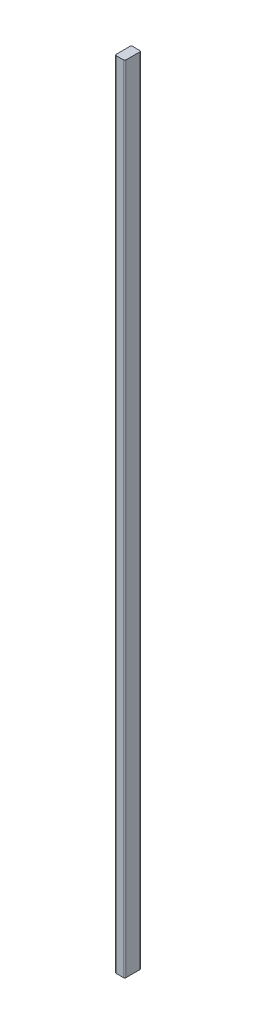
ISO-10303-21;
HEADER;
FILE_DESCRIPTION(('STEP AP214'),'2;1');
FILE_NAME('part.step','',(''),(''),'','','');
FILE_SCHEMA(('AUTOMOTIVE_DESIGN { 1 0 10303 214 1 1 1 1 }'));
ENDSEC;
DATA;
#1=APPLICATION_CONTEXT('core data for automotive mechanical design processes');
#2=APPLICATION_PROTOCOL_DEFINITION('international standard','automotive_design',2000,#1);
#3=PRODUCT_CONTEXT('',#1,'mechanical');
#4=PRODUCT('Part','Part','',(#3));
#5=PRODUCT_RELATED_PRODUCT_CATEGORY('part','',(#4));
#6=PRODUCT_DEFINITION_FORMATION('','',#4);
#7=PRODUCT_DEFINITION_CONTEXT('part definition',#1,'design');
#8=PRODUCT_DEFINITION('design','',#6,#7);
#9=PRODUCT_DEFINITION_SHAPE('','',#8);
#10=(LENGTH_UNIT() NAMED_UNIT(*) SI_UNIT(.MILLI.,.METRE.));
#11=(NAMED_UNIT(*) PLANE_ANGLE_UNIT() SI_UNIT($,.RADIAN.));
#12=(NAMED_UNIT(*) SI_UNIT($,.STERADIAN.) SOLID_ANGLE_UNIT());
#13=UNCERTAINTY_MEASURE_WITH_UNIT(LENGTH_MEASURE(1.E-05),#10,'distance_accuracy_value','');
#14=(GEOMETRIC_REPRESENTATION_CONTEXT(3) GLOBAL_UNCERTAINTY_ASSIGNED_CONTEXT((#13)) GLOBAL_UNIT_ASSIGNED_CONTEXT((#10,
#11,#12)) REPRESENTATION_CONTEXT('',''));
#15=CARTESIAN_POINT('',(0.,0.,0.));
#16=DIRECTION('',(0.,0.,1.));
#17=DIRECTION('',(1.,0.,0.));
#18=AXIS2_PLACEMENT_3D('',#15,#16,#17);
#19=CARTESIAN_POINT('',(2.25,489.,4.25));
#20=DIRECTION('',(0.,-1.,0.));
#21=DIRECTION('',(0.,0.,-1.));
#22=AXIS2_PLACEMENT_3D('',#19,#20,#21);
#23=CYLINDRICAL_SURFACE('',#22,0.75);
#24=CARTESIAN_POINT('',(2.25,0.,4.25));
#25=DIRECTION('',(0.,1.,0.));
#26=DIRECTION('',(0.,0.,1.));
#27=AXIS2_PLACEMENT_3D('',#24,#25,#26);
#28=CIRCLE('',#27,0.75);
#29=CARTESIAN_POINT('',(2.25,0.,5.));
#30=VERTEX_POINT('',#29);
#31=CARTESIAN_POINT('',(3.,0.,4.24999999999999));
#32=VERTEX_POINT('',#31);
#33=EDGE_CURVE('E131',#30,#32,#28,.T.);
#34=ORIENTED_EDGE('',*,*,#33,.T.);
#35=DIRECTION('',(0.,-1.,0.));
#36=VECTOR('',#35,1.);
#37=CARTESIAN_POINT('',(3.,489.,4.24999999999999));
#38=LINE('',#37,#36);
#39=CARTESIAN_POINT('',(3.,489.,4.24999999999999));
#40=VERTEX_POINT('',#39);
#41=EDGE_CURVE('E11',#40,#32,#38,.T.);
#42=ORIENTED_EDGE('',*,*,#41,.F.);
#43=CARTESIAN_POINT('',(2.25,489.,4.25));
#44=DIRECTION('',(0.,1.,0.));
#45=DIRECTION('',(0.,0.,1.));
#46=AXIS2_PLACEMENT_3D('',#43,#44,#45);
#47=CIRCLE('',#46,0.75);
#48=CARTESIAN_POINT('',(2.25,489.,5.));
#49=VERTEX_POINT('',#48);
#50=EDGE_CURVE('E145',#49,#40,#47,.T.);
#51=ORIENTED_EDGE('',*,*,#50,.F.);
#52=DIRECTION('',(0.,-1.,0.));
#53=VECTOR('',#52,1.);
#54=CARTESIAN_POINT('',(2.25,489.,5.));
#55=LINE('',#54,#53);
#56=EDGE_CURVE('E127',#49,#30,#55,.T.);
#57=ORIENTED_EDGE('',*,*,#56,.T.);
#58=EDGE_LOOP('',(#34,#42,#51,#57));
#59=FACE_BOUND('',#58,.T.);
#60=ADVANCED_FACE('F35',(#59),#23,.T.);
#61=CARTESIAN_POINT('',(3.,489.,-4.25));
#62=DIRECTION('',(-1.,0.,0.));
#63=DIRECTION('',(0.,0.,1.));
#64=AXIS2_PLACEMENT_3D('',#61,#62,#63);
#65=PLANE('',#64);
#66=DIRECTION('',(0.,0.,-1.));
#67=VECTOR('',#66,1.);
#68=CARTESIAN_POINT('',(3.,0.,-4.25));
#69=LINE('',#68,#67);
#70=CARTESIAN_POINT('',(3.,0.,-4.25));
#71=VERTEX_POINT('',#70);
#72=EDGE_CURVE('E134',#32,#71,#69,.T.);
#73=ORIENTED_EDGE('',*,*,#72,.T.);
#74=DIRECTION('',(0.,-1.,0.));
#75=VECTOR('',#74,1.);
#76=CARTESIAN_POINT('',(3.,489.,-4.25));
#77=LINE('',#76,#75);
#78=CARTESIAN_POINT('',(3.,489.,-4.25));
#79=VERTEX_POINT('',#78);
#80=EDGE_CURVE('E43',#79,#71,#77,.T.);
#81=ORIENTED_EDGE('',*,*,#80,.F.);
#82=DIRECTION('',(0.,0.,-1.));
#83=VECTOR('',#82,1.);
#84=CARTESIAN_POINT('',(3.,489.,-4.25));
#85=LINE('',#84,#83);
#86=EDGE_CURVE('E94',#40,#79,#85,.T.);
#87=ORIENTED_EDGE('',*,*,#86,.F.);
#88=ORIENTED_EDGE('',*,*,#41,.T.);
#89=EDGE_LOOP('',(#73,#81,#87,#88));
#90=FACE_BOUND('',#89,.T.);
#91=ADVANCED_FACE('F180',(#90),#65,.F.);
#92=CARTESIAN_POINT('',(2.25,489.,-4.25));
#93=DIRECTION('',(0.,-1.,0.));
#94=DIRECTION('',(0.,0.,-1.));
#95=AXIS2_PLACEMENT_3D('',#92,#93,#94);
#96=CYLINDRICAL_SURFACE('',#95,0.75);
#97=CARTESIAN_POINT('',(2.25,0.,-4.25));
#98=DIRECTION('',(0.,1.,0.));
#99=DIRECTION('',(0.,0.,-1.));
#100=AXIS2_PLACEMENT_3D('',#97,#98,#99);
#101=CIRCLE('',#100,0.75);
#102=CARTESIAN_POINT('',(2.24999999999999,0.,-5.));
#103=VERTEX_POINT('',#102);
#104=EDGE_CURVE('E136',#71,#103,#101,.T.);
#105=ORIENTED_EDGE('',*,*,#104,.T.);
#106=DIRECTION('',(0.,-1.,0.));
#107=VECTOR('',#106,1.);
#108=CARTESIAN_POINT('',(2.24999999999999,489.,-5.));
#109=LINE('',#108,#107);
#110=CARTESIAN_POINT('',(2.24999999999999,489.,-5.));
#111=VERTEX_POINT('',#110);
#112=EDGE_CURVE('E152',#111,#103,#109,.T.);
#113=ORIENTED_EDGE('',*,*,#112,.F.);
#114=CARTESIAN_POINT('',(2.25,489.,-4.25));
#115=DIRECTION('',(0.,1.,0.));
#116=DIRECTION('',(0.,0.,-1.));
#117=AXIS2_PLACEMENT_3D('',#114,#115,#116);
#118=CIRCLE('',#117,0.75);
#119=EDGE_CURVE('E160',#79,#111,#118,.T.);
#120=ORIENTED_EDGE('',*,*,#119,.F.);
#121=ORIENTED_EDGE('',*,*,#80,.T.);
#122=EDGE_LOOP('',(#105,#113,#120,#121));
#123=FACE_BOUND('',#122,.T.);
#124=ADVANCED_FACE('F158',(#123),#96,.T.);
#125=CARTESIAN_POINT('',(2.24999999999999,489.,-5.));
#126=DIRECTION('',(0.,0.,1.));
#127=DIRECTION('',(1.,0.,0.));
#128=AXIS2_PLACEMENT_3D('',#125,#126,#127);
#129=PLANE('',#128);
#130=DIRECTION('',(-1.,0.,0.));
#131=VECTOR('',#130,1.);
#132=CARTESIAN_POINT('',(2.24999999999999,0.,-5.));
#133=LINE('',#132,#131);
#134=CARTESIAN_POINT('',(-2.25,0.,-5.));
#135=VERTEX_POINT('',#134);
#136=EDGE_CURVE('E138',#103,#135,#133,.T.);
#137=ORIENTED_EDGE('',*,*,#136,.T.);
#138=DIRECTION('',(0.,-1.,0.));
#139=VECTOR('',#138,1.);
#140=CARTESIAN_POINT('',(-2.25,489.,-5.));
#141=LINE('',#140,#139);
#142=CARTESIAN_POINT('',(-2.25,489.,-5.));
#143=VERTEX_POINT('',#142);
#144=EDGE_CURVE('E149',#143,#135,#141,.T.);
#145=ORIENTED_EDGE('',*,*,#144,.F.);
#146=DIRECTION('',(-1.,0.,0.));
#147=VECTOR('',#146,1.);
#148=CARTESIAN_POINT('',(2.24999999999999,489.,-5.));
#149=LINE('',#148,#147);
#150=EDGE_CURVE('E172',#111,#143,#149,.T.);
#151=ORIENTED_EDGE('',*,*,#150,.F.);
#152=ORIENTED_EDGE('',*,*,#112,.T.);
#153=EDGE_LOOP('',(#137,#145,#151,#152));
#154=FACE_BOUND('',#153,.T.);
#155=ADVANCED_FACE('F168',(#154),#129,.F.);
#156=CARTESIAN_POINT('',(-2.25,489.,-4.25));
#157=DIRECTION('',(0.,-1.,0.));
#158=DIRECTION('',(0.,0.,-1.));
#159=AXIS2_PLACEMENT_3D('',#156,#157,#158);
#160=CYLINDRICAL_SURFACE('',#159,0.75);
#161=CARTESIAN_POINT('',(-2.25,0.,-4.25));
#162=DIRECTION('',(0.,1.,0.));
#163=DIRECTION('',(0.,0.,1.));
#164=AXIS2_PLACEMENT_3D('',#161,#162,#163);
#165=CIRCLE('',#164,0.75);
#166=CARTESIAN_POINT('',(-3.,0.,-4.24999999999999));
#167=VERTEX_POINT('',#166);
#168=EDGE_CURVE('E140',#135,#167,#165,.T.);
#169=ORIENTED_EDGE('',*,*,#168,.T.);
#170=DIRECTION('',(0.,-1.,0.));
#171=VECTOR('',#170,1.);
#172=CARTESIAN_POINT('',(-3.,489.,-4.24999999999999));
#173=LINE('',#172,#171);
#174=CARTESIAN_POINT('',(-3.,489.,-4.24999999999999));
#175=VERTEX_POINT('',#174);
#176=EDGE_CURVE('E122',#175,#167,#173,.T.);
#177=ORIENTED_EDGE('',*,*,#176,.F.);
#178=CARTESIAN_POINT('',(-2.25,489.,-4.25));
#179=DIRECTION('',(0.,1.,0.));
#180=DIRECTION('',(0.,0.,1.));
#181=AXIS2_PLACEMENT_3D('',#178,#179,#180);
#182=CIRCLE('',#181,0.75);
#183=EDGE_CURVE('E113',#143,#175,#182,.T.);
#184=ORIENTED_EDGE('',*,*,#183,.F.);
#185=ORIENTED_EDGE('',*,*,#144,.T.);
#186=EDGE_LOOP('',(#169,#177,#184,#185));
#187=FACE_BOUND('',#186,.T.);
#188=ADVANCED_FACE('F171',(#187),#160,.T.);
#189=CARTESIAN_POINT('',(-3.,489.,-4.24999999999999));
#190=DIRECTION('',(1.,0.,0.));
#191=DIRECTION('',(0.,0.,-1.));
#192=AXIS2_PLACEMENT_3D('',#189,#190,#191);
#193=PLANE('',#192);
#194=DIRECTION('',(0.,0.,1.));
#195=VECTOR('',#194,1.);
#196=CARTESIAN_POINT('',(-3.,0.,-4.24999999999999));
#197=LINE('',#196,#195);
#198=CARTESIAN_POINT('',(-3.,0.,4.25));
#199=VERTEX_POINT('',#198);
#200=EDGE_CURVE('E121',#167,#199,#197,.T.);
#201=ORIENTED_EDGE('',*,*,#200,.T.);
#202=DIRECTION('',(0.,-1.,0.));
#203=VECTOR('',#202,1.);
#204=CARTESIAN_POINT('',(-3.,489.,4.25));
#205=LINE('',#204,#203);
#206=CARTESIAN_POINT('',(-3.,489.,4.25));
#207=VERTEX_POINT('',#206);
#208=EDGE_CURVE('E118',#207,#199,#205,.T.);
#209=ORIENTED_EDGE('',*,*,#208,.F.);
#210=DIRECTION('',(0.,0.,1.));
#211=VECTOR('',#210,1.);
#212=CARTESIAN_POINT('',(-3.,489.,-4.24999999999999));
#213=LINE('',#212,#211);
#214=EDGE_CURVE('E107',#175,#207,#213,.T.);
#215=ORIENTED_EDGE('',*,*,#214,.F.);
#216=ORIENTED_EDGE('',*,*,#176,.T.);
#217=EDGE_LOOP('',(#201,#209,#215,#216));
#218=FACE_BOUND('',#217,.T.);
#219=ADVANCED_FACE('F119',(#218),#193,.F.);
#220=CARTESIAN_POINT('',(-2.25,489.,4.25));
#221=DIRECTION('',(0.,-1.,0.));
#222=DIRECTION('',(0.,0.,-1.));
#223=AXIS2_PLACEMENT_3D('',#220,#221,#222);
#224=CYLINDRICAL_SURFACE('',#223,0.75);
#225=CARTESIAN_POINT('',(-2.25,0.,4.25));
#226=DIRECTION('',(0.,1.,0.));
#227=DIRECTION('',(0.,0.,1.));
#228=AXIS2_PLACEMENT_3D('',#225,#226,#227);
#229=CIRCLE('',#228,0.75);
#230=CARTESIAN_POINT('',(-2.24999999999999,0.,5.));
#231=VERTEX_POINT('',#230);
#232=EDGE_CURVE('E80',#199,#231,#229,.T.);
#233=ORIENTED_EDGE('',*,*,#232,.T.);
#234=DIRECTION('',(0.,-1.,0.));
#235=VECTOR('',#234,1.);
#236=CARTESIAN_POINT('',(-2.24999999999999,489.,5.));
#237=LINE('',#236,#235);
#238=CARTESIAN_POINT('',(-2.24999999999999,489.,5.));
#239=VERTEX_POINT('',#238);
#240=EDGE_CURVE('E123',#239,#231,#237,.T.);
#241=ORIENTED_EDGE('',*,*,#240,.F.);
#242=CARTESIAN_POINT('',(-2.25,489.,4.25));
#243=DIRECTION('',(0.,1.,0.));
#244=DIRECTION('',(0.,0.,1.));
#245=AXIS2_PLACEMENT_3D('',#242,#243,#244);
#246=CIRCLE('',#245,0.75);
#247=EDGE_CURVE('E111',#207,#239,#246,.T.);
#248=ORIENTED_EDGE('',*,*,#247,.F.);
#249=ORIENTED_EDGE('',*,*,#208,.T.);
#250=EDGE_LOOP('',(#233,#241,#248,#249));
#251=FACE_BOUND('',#250,.T.);
#252=ADVANCED_FACE('F125',(#251),#224,.T.);
#253=CARTESIAN_POINT('',(2.25,489.,5.));
#254=DIRECTION('',(0.,0.,-1.));
#255=DIRECTION('',(-1.,0.,0.));
#256=AXIS2_PLACEMENT_3D('',#253,#254,#255);
#257=PLANE('',#256);
#258=DIRECTION('',(1.,0.,0.));
#259=VECTOR('',#258,1.);
#260=CARTESIAN_POINT('',(2.25,0.,5.));
#261=LINE('',#260,#259);
#262=EDGE_CURVE('E86',#231,#30,#261,.T.);
#263=ORIENTED_EDGE('',*,*,#262,.T.);
#264=ORIENTED_EDGE('',*,*,#56,.F.);
#265=DIRECTION('',(1.,0.,0.));
#266=VECTOR('',#265,1.);
#267=CARTESIAN_POINT('',(2.25,489.,5.));
#268=LINE('',#267,#266);
#269=EDGE_CURVE('E51',#239,#49,#268,.T.);
#270=ORIENTED_EDGE('',*,*,#269,.F.);
#271=ORIENTED_EDGE('',*,*,#240,.T.);
#272=EDGE_LOOP('',(#263,#264,#270,#271));
#273=FACE_BOUND('',#272,.T.);
#274=ADVANCED_FACE('F196',(#273),#257,.F.);
#275=CARTESIAN_POINT('',(2.25,489.,4.25));
#276=DIRECTION('',(0.,1.,0.));
#277=DIRECTION('',(0.,0.,1.));
#278=AXIS2_PLACEMENT_3D('',#275,#276,#277);
#279=PLANE('',#278);
#280=ORIENTED_EDGE('',*,*,#50,.T.);
#281=ORIENTED_EDGE('',*,*,#86,.T.);
#282=ORIENTED_EDGE('',*,*,#119,.T.);
#283=ORIENTED_EDGE('',*,*,#150,.T.);
#284=ORIENTED_EDGE('',*,*,#183,.T.);
#285=ORIENTED_EDGE('',*,*,#214,.T.);
#286=ORIENTED_EDGE('',*,*,#247,.T.);
#287=ORIENTED_EDGE('',*,*,#269,.T.);
#288=EDGE_LOOP('',(#280,#281,#282,#283,#284,#285,#286,#287));
#289=FACE_BOUND('',#288,.T.);
#290=ADVANCED_FACE('F109',(#289),#279,.T.);
#291=CARTESIAN_POINT('',(2.25,0.,4.25));
#292=DIRECTION('',(0.,1.,0.));
#293=DIRECTION('',(0.,0.,1.));
#294=AXIS2_PLACEMENT_3D('',#291,#292,#293);
#295=PLANE('',#294);
#296=ORIENTED_EDGE('',*,*,#33,.F.);
#297=ORIENTED_EDGE('',*,*,#262,.F.);
#298=ORIENTED_EDGE('',*,*,#232,.F.);
#299=ORIENTED_EDGE('',*,*,#200,.F.);
#300=ORIENTED_EDGE('',*,*,#168,.F.);
#301=ORIENTED_EDGE('',*,*,#136,.F.);
#302=ORIENTED_EDGE('',*,*,#104,.F.);
#303=ORIENTED_EDGE('',*,*,#72,.F.);
#304=EDGE_LOOP('',(#296,#297,#298,#299,#300,#301,#302,#303));
#305=FACE_BOUND('',#304,.T.);
#306=ADVANCED_FACE('F164',(#305),#295,.F.);
#307=CLOSED_SHELL('',(#60,#91,#124,#155,#188,#219,#252,#274,#290,#306));
#308=MANIFOLD_SOLID_BREP('B2',#307);
#309=ADVANCED_BREP_SHAPE_REPRESENTATION('',(#18,#308),#14);
#310=SHAPE_DEFINITION_REPRESENTATION(#9,#309);
ENDSEC;
END-ISO-10303-21;
